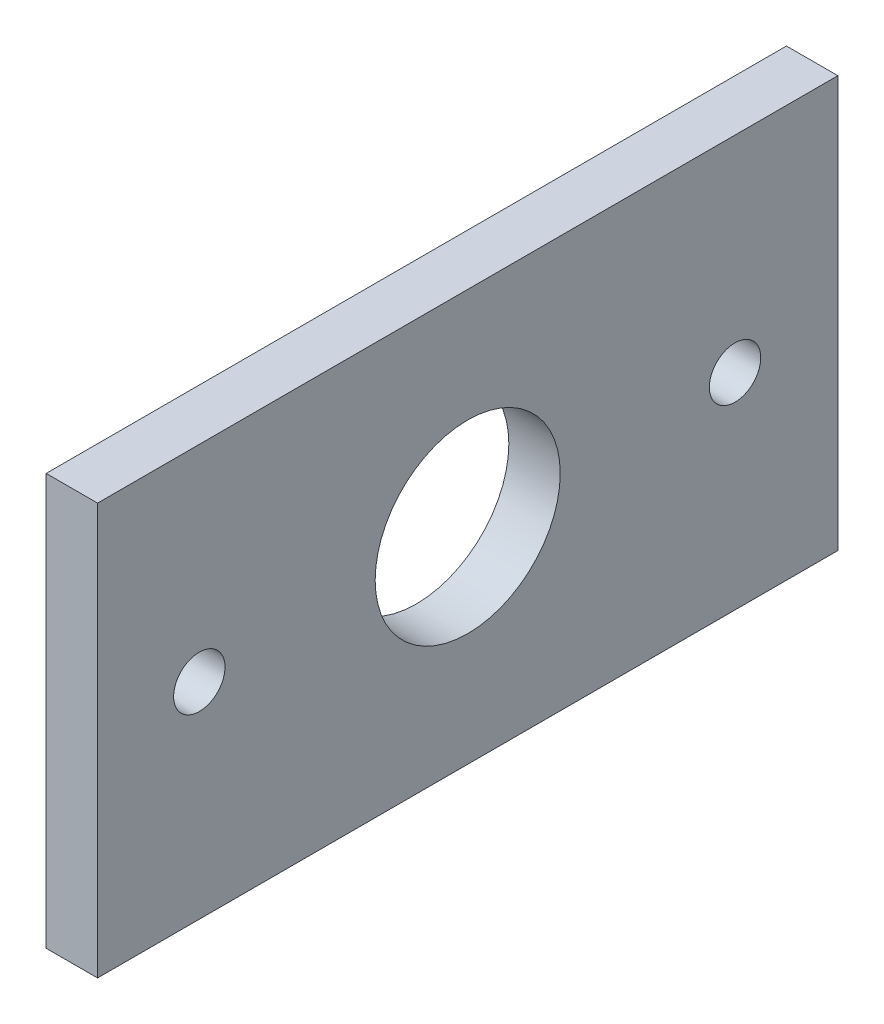
ISO-10303-21;
HEADER;
FILE_DESCRIPTION(('STEP AP214'),'2;1');
FILE_NAME('part.step','',(''),(''),'','','');
FILE_SCHEMA(('AUTOMOTIVE_DESIGN { 1 0 10303 214 1 1 1 1 }'));
ENDSEC;
DATA;
#1=APPLICATION_CONTEXT('core data for automotive mechanical design processes');
#2=APPLICATION_PROTOCOL_DEFINITION('international standard','automotive_design',2000,#1);
#3=PRODUCT_CONTEXT('',#1,'mechanical');
#4=PRODUCT('Part','Part','',(#3));
#5=PRODUCT_RELATED_PRODUCT_CATEGORY('part','',(#4));
#6=PRODUCT_DEFINITION_FORMATION('','',#4);
#7=PRODUCT_DEFINITION_CONTEXT('part definition',#1,'design');
#8=PRODUCT_DEFINITION('design','',#6,#7);
#9=PRODUCT_DEFINITION_SHAPE('','',#8);
#10=(LENGTH_UNIT() NAMED_UNIT(*) SI_UNIT(.MILLI.,.METRE.));
#11=(NAMED_UNIT(*) PLANE_ANGLE_UNIT() SI_UNIT($,.RADIAN.));
#12=(NAMED_UNIT(*) SI_UNIT($,.STERADIAN.) SOLID_ANGLE_UNIT());
#13=UNCERTAINTY_MEASURE_WITH_UNIT(LENGTH_MEASURE(1.E-05),#10,'distance_accuracy_value','');
#14=(GEOMETRIC_REPRESENTATION_CONTEXT(3) GLOBAL_UNCERTAINTY_ASSIGNED_CONTEXT((#13)) GLOBAL_UNIT_ASSIGNED_CONTEXT((#10,
#11,#12)) REPRESENTATION_CONTEXT('',''));
#15=CARTESIAN_POINT('',(0.,0.,0.));
#16=DIRECTION('',(0.,0.,1.));
#17=DIRECTION('',(1.,0.,0.));
#18=AXIS2_PLACEMENT_3D('',#15,#16,#17);
#19=CARTESIAN_POINT('',(5.,0.,0.));
#20=DIRECTION('',(1.,0.,0.));
#21=DIRECTION('',(0.,0.,-1.));
#22=AXIS2_PLACEMENT_3D('',#19,#20,#21);
#23=PLANE('',#22);
#24=CARTESIAN_POINT('',(5.,-20.,-9.89625483386769));
#25=DIRECTION('',(1.,0.,0.));
#26=DIRECTION('',(0.,0.,-1.));
#27=AXIS2_PLACEMENT_3D('',#24,#25,#26);
#28=CIRCLE('',#27,2.5);
#29=CARTESIAN_POINT('',(5.,-20.,-12.3962548338677));
#30=VERTEX_POINT('',#29);
#31=EDGE_CURVE('E115',#30,#30,#28,.T.);
#32=ORIENTED_EDGE('',*,*,#31,.F.);
#33=EDGE_LOOP('',(#32));
#34=FACE_BOUND('',#33,.T.);
#35=DIRECTION('',(0.,-1.,0.));
#36=VECTOR('',#35,1.);
#37=CARTESIAN_POINT('',(5.,0.,0.));
#38=LINE('',#37,#36);
#39=CARTESIAN_POINT('',(5.,0.,0.));
#40=VERTEX_POINT('',#39);
#41=CARTESIAN_POINT('',(5.,-40.,0.));
#42=VERTEX_POINT('',#41);
#43=EDGE_CURVE('E85',#40,#42,#38,.T.);
#44=ORIENTED_EDGE('',*,*,#43,.T.);
#45=DIRECTION('',(0.,0.,-1.));
#46=VECTOR('',#45,1.);
#47=CARTESIAN_POINT('',(5.,-40.,0.));
#48=LINE('',#47,#46);
#49=CARTESIAN_POINT('',(5.,-40.,-72.));
#50=VERTEX_POINT('',#49);
#51=EDGE_CURVE('E80',#42,#50,#48,.T.);
#52=ORIENTED_EDGE('',*,*,#51,.T.);
#53=DIRECTION('',(0.,1.,0.));
#54=VECTOR('',#53,1.);
#55=CARTESIAN_POINT('',(5.,0.,-72.));
#56=LINE('',#55,#54);
#57=CARTESIAN_POINT('',(5.,0.,-72.));
#58=VERTEX_POINT('',#57);
#59=EDGE_CURVE('E83',#50,#58,#56,.T.);
#60=ORIENTED_EDGE('',*,*,#59,.T.);
#61=DIRECTION('',(0.,0.,1.));
#62=VECTOR('',#61,1.);
#63=CARTESIAN_POINT('',(5.,0.,0.));
#64=LINE('',#63,#62);
#65=EDGE_CURVE('E50',#58,#40,#64,.T.);
#66=ORIENTED_EDGE('',*,*,#65,.T.);
#67=EDGE_LOOP('',(#44,#52,#60,#66));
#68=FACE_BOUND('',#67,.T.);
#69=CARTESIAN_POINT('',(5.,-20.,-36.));
#70=DIRECTION('',(1.,0.,0.));
#71=DIRECTION('',(0.,0.,-1.));
#72=AXIS2_PLACEMENT_3D('',#69,#70,#71);
#73=CIRCLE('',#72,9.);
#74=CARTESIAN_POINT('',(5.,-20.,-45.));
#75=VERTEX_POINT('',#74);
#76=EDGE_CURVE('E100',#75,#75,#73,.T.);
#77=ORIENTED_EDGE('',*,*,#76,.F.);
#78=EDGE_LOOP('',(#77));
#79=FACE_BOUND('',#78,.T.);
#80=CARTESIAN_POINT('',(5.,-20.,-62.));
#81=DIRECTION('',(1.,0.,0.));
#82=DIRECTION('',(0.,0.,-1.));
#83=AXIS2_PLACEMENT_3D('',#80,#81,#82);
#84=CIRCLE('',#83,2.5);
#85=CARTESIAN_POINT('',(5.,-20.,-64.5));
#86=VERTEX_POINT('',#85);
#87=EDGE_CURVE('E121',#86,#86,#84,.T.);
#88=ORIENTED_EDGE('',*,*,#87,.F.);
#89=EDGE_LOOP('',(#88));
#90=FACE_BOUND('',#89,.T.);
#91=ADVANCED_FACE('F33',(#34,#68,#79,#90),#23,.T.);
#92=CARTESIAN_POINT('',(0.,0.,0.));
#93=DIRECTION('',(1.,0.,0.));
#94=DIRECTION('',(0.,0.,-1.));
#95=AXIS2_PLACEMENT_3D('',#92,#93,#94);
#96=PLANE('',#95);
#97=DIRECTION('',(0.,-1.,0.));
#98=VECTOR('',#97,1.);
#99=CARTESIAN_POINT('',(0.,0.,0.));
#100=LINE('',#99,#98);
#101=CARTESIAN_POINT('',(0.,0.,0.));
#102=VERTEX_POINT('',#101);
#103=CARTESIAN_POINT('',(0.,-40.,0.));
#104=VERTEX_POINT('',#103);
#105=EDGE_CURVE('E97',#102,#104,#100,.T.);
#106=ORIENTED_EDGE('',*,*,#105,.F.);
#107=DIRECTION('',(0.,0.,1.));
#108=VECTOR('',#107,1.);
#109=CARTESIAN_POINT('',(0.,0.,0.));
#110=LINE('',#109,#108);
#111=CARTESIAN_POINT('',(0.,0.,-72.));
#112=VERTEX_POINT('',#111);
#113=EDGE_CURVE('E73',#112,#102,#110,.T.);
#114=ORIENTED_EDGE('',*,*,#113,.F.);
#115=DIRECTION('',(0.,1.,0.));
#116=VECTOR('',#115,1.);
#117=CARTESIAN_POINT('',(0.,0.,-72.));
#118=LINE('',#117,#116);
#119=CARTESIAN_POINT('',(0.,-40.,-72.));
#120=VERTEX_POINT('',#119);
#121=EDGE_CURVE('E67',#120,#112,#118,.T.);
#122=ORIENTED_EDGE('',*,*,#121,.F.);
#123=DIRECTION('',(0.,0.,-1.));
#124=VECTOR('',#123,1.);
#125=CARTESIAN_POINT('',(0.,-40.,0.));
#126=LINE('',#125,#124);
#127=EDGE_CURVE('E89',#104,#120,#126,.T.);
#128=ORIENTED_EDGE('',*,*,#127,.F.);
#129=EDGE_LOOP('',(#106,#114,#122,#128));
#130=FACE_BOUND('',#129,.T.);
#131=CARTESIAN_POINT('',(0.,-20.,-36.));
#132=DIRECTION('',(1.,0.,0.));
#133=DIRECTION('',(0.,0.,-1.));
#134=AXIS2_PLACEMENT_3D('',#131,#132,#133);
#135=CIRCLE('',#134,9.);
#136=CARTESIAN_POINT('',(0.,-20.,-45.));
#137=VERTEX_POINT('',#136);
#138=EDGE_CURVE('E112',#137,#137,#135,.T.);
#139=ORIENTED_EDGE('',*,*,#138,.T.);
#140=EDGE_LOOP('',(#139));
#141=FACE_BOUND('',#140,.T.);
#142=CARTESIAN_POINT('',(0.,-20.,-9.89625483386769));
#143=DIRECTION('',(1.,0.,0.));
#144=DIRECTION('',(0.,0.,-1.));
#145=AXIS2_PLACEMENT_3D('',#142,#143,#144);
#146=CIRCLE('',#145,2.5);
#147=CARTESIAN_POINT('',(0.,-20.,-12.3962548338677));
#148=VERTEX_POINT('',#147);
#149=EDGE_CURVE('E118',#148,#148,#146,.T.);
#150=ORIENTED_EDGE('',*,*,#149,.T.);
#151=EDGE_LOOP('',(#150));
#152=FACE_BOUND('',#151,.T.);
#153=CARTESIAN_POINT('',(0.,-20.,-62.));
#154=DIRECTION('',(1.,0.,0.));
#155=DIRECTION('',(0.,0.,-1.));
#156=AXIS2_PLACEMENT_3D('',#153,#154,#155);
#157=CIRCLE('',#156,2.5);
#158=CARTESIAN_POINT('',(0.,-20.,-64.5));
#159=VERTEX_POINT('',#158);
#160=EDGE_CURVE('E124',#159,#159,#157,.T.);
#161=ORIENTED_EDGE('',*,*,#160,.T.);
#162=EDGE_LOOP('',(#161));
#163=FACE_BOUND('',#162,.T.);
#164=ADVANCED_FACE('F108',(#130,#141,#152,#163),#96,.F.);
#165=CARTESIAN_POINT('',(5.,0.,0.));
#166=DIRECTION('',(0.,0.,-1.));
#167=DIRECTION('',(0.,1.,0.));
#168=AXIS2_PLACEMENT_3D('',#165,#166,#167);
#169=PLANE('',#168);
#170=ORIENTED_EDGE('',*,*,#105,.T.);
#171=DIRECTION('',(-1.,0.,0.));
#172=VECTOR('',#171,1.);
#173=CARTESIAN_POINT('',(5.,-40.,0.));
#174=LINE('',#173,#172);
#175=EDGE_CURVE('E11',#42,#104,#174,.T.);
#176=ORIENTED_EDGE('',*,*,#175,.F.);
#177=ORIENTED_EDGE('',*,*,#43,.F.);
#178=DIRECTION('',(-1.,0.,0.));
#179=VECTOR('',#178,1.);
#180=CARTESIAN_POINT('',(5.,0.,0.));
#181=LINE('',#180,#179);
#182=EDGE_CURVE('E93',#40,#102,#181,.T.);
#183=ORIENTED_EDGE('',*,*,#182,.T.);
#184=EDGE_LOOP('',(#170,#176,#177,#183));
#185=FACE_BOUND('',#184,.T.);
#186=ADVANCED_FACE('F35',(#185),#169,.F.);
#187=CARTESIAN_POINT('',(5.,-40.,0.));
#188=DIRECTION('',(0.,1.,0.));
#189=DIRECTION('',(0.,0.,1.));
#190=AXIS2_PLACEMENT_3D('',#187,#188,#189);
#191=PLANE('',#190);
#192=ORIENTED_EDGE('',*,*,#127,.T.);
#193=DIRECTION('',(-1.,0.,0.));
#194=VECTOR('',#193,1.);
#195=CARTESIAN_POINT('',(5.,-40.,-72.));
#196=LINE('',#195,#194);
#197=EDGE_CURVE('E42',#50,#120,#196,.T.);
#198=ORIENTED_EDGE('',*,*,#197,.F.);
#199=ORIENTED_EDGE('',*,*,#51,.F.);
#200=ORIENTED_EDGE('',*,*,#175,.T.);
#201=EDGE_LOOP('',(#192,#198,#199,#200));
#202=FACE_BOUND('',#201,.T.);
#203=ADVANCED_FACE('F88',(#202),#191,.F.);
#204=CARTESIAN_POINT('',(5.,0.,-72.));
#205=DIRECTION('',(0.,0.,1.));
#206=DIRECTION('',(1.,0.,0.));
#207=AXIS2_PLACEMENT_3D('',#204,#205,#206);
#208=PLANE('',#207);
#209=ORIENTED_EDGE('',*,*,#121,.T.);
#210=DIRECTION('',(-1.,0.,0.));
#211=VECTOR('',#210,1.);
#212=CARTESIAN_POINT('',(5.,0.,-72.));
#213=LINE('',#212,#211);
#214=EDGE_CURVE('E90',#58,#112,#213,.T.);
#215=ORIENTED_EDGE('',*,*,#214,.F.);
#216=ORIENTED_EDGE('',*,*,#59,.F.);
#217=ORIENTED_EDGE('',*,*,#197,.T.);
#218=EDGE_LOOP('',(#209,#215,#216,#217));
#219=FACE_BOUND('',#218,.T.);
#220=ADVANCED_FACE('F91',(#219),#208,.F.);
#221=CARTESIAN_POINT('',(5.,0.,0.));
#222=DIRECTION('',(0.,-1.,0.));
#223=DIRECTION('',(0.,0.,-1.));
#224=AXIS2_PLACEMENT_3D('',#221,#222,#223);
#225=PLANE('',#224);
#226=ORIENTED_EDGE('',*,*,#113,.T.);
#227=ORIENTED_EDGE('',*,*,#182,.F.);
#228=ORIENTED_EDGE('',*,*,#65,.F.);
#229=ORIENTED_EDGE('',*,*,#214,.T.);
#230=EDGE_LOOP('',(#226,#227,#228,#229));
#231=FACE_BOUND('',#230,.T.);
#232=ADVANCED_FACE('F105',(#231),#225,.F.);
#233=CARTESIAN_POINT('',(5.,-20.,-36.));
#234=DIRECTION('',(-1.,0.,0.));
#235=DIRECTION('',(0.,0.,1.));
#236=AXIS2_PLACEMENT_3D('',#233,#234,#235);
#237=CYLINDRICAL_SURFACE('',#236,9.);
#238=ORIENTED_EDGE('',*,*,#76,.T.);
#239=EDGE_LOOP('',(#238));
#240=FACE_BOUND('',#239,.T.);
#241=ORIENTED_EDGE('',*,*,#138,.F.);
#242=EDGE_LOOP('',(#241));
#243=FACE_BOUND('',#242,.T.);
#244=ADVANCED_FACE('F142',(#240,#243),#237,.F.);
#245=CARTESIAN_POINT('',(5.,-20.,-9.89625483386769));
#246=DIRECTION('',(-1.,0.,0.));
#247=DIRECTION('',(0.,0.,1.));
#248=AXIS2_PLACEMENT_3D('',#245,#246,#247);
#249=CYLINDRICAL_SURFACE('',#248,2.5);
#250=ORIENTED_EDGE('',*,*,#31,.T.);
#251=EDGE_LOOP('',(#250));
#252=FACE_BOUND('',#251,.T.);
#253=ORIENTED_EDGE('',*,*,#149,.F.);
#254=EDGE_LOOP('',(#253));
#255=FACE_BOUND('',#254,.T.);
#256=ADVANCED_FACE('F188',(#252,#255),#249,.F.);
#257=CARTESIAN_POINT('',(5.,-20.,-62.));
#258=DIRECTION('',(-1.,0.,0.));
#259=DIRECTION('',(0.,0.,1.));
#260=AXIS2_PLACEMENT_3D('',#257,#258,#259);
#261=CYLINDRICAL_SURFACE('',#260,2.5);
#262=ORIENTED_EDGE('',*,*,#87,.T.);
#263=EDGE_LOOP('',(#262));
#264=FACE_BOUND('',#263,.T.);
#265=ORIENTED_EDGE('',*,*,#160,.F.);
#266=EDGE_LOOP('',(#265));
#267=FACE_BOUND('',#266,.T.);
#268=ADVANCED_FACE('F130',(#264,#267),#261,.F.);
#269=CLOSED_SHELL('',(#91,#164,#186,#203,#220,#232,#244,#256,#268));
#270=MANIFOLD_SOLID_BREP('B2',#269);
#271=ADVANCED_BREP_SHAPE_REPRESENTATION('',(#18,#270),#14);
#272=SHAPE_DEFINITION_REPRESENTATION(#9,#271);
ENDSEC;
END-ISO-10303-21;
